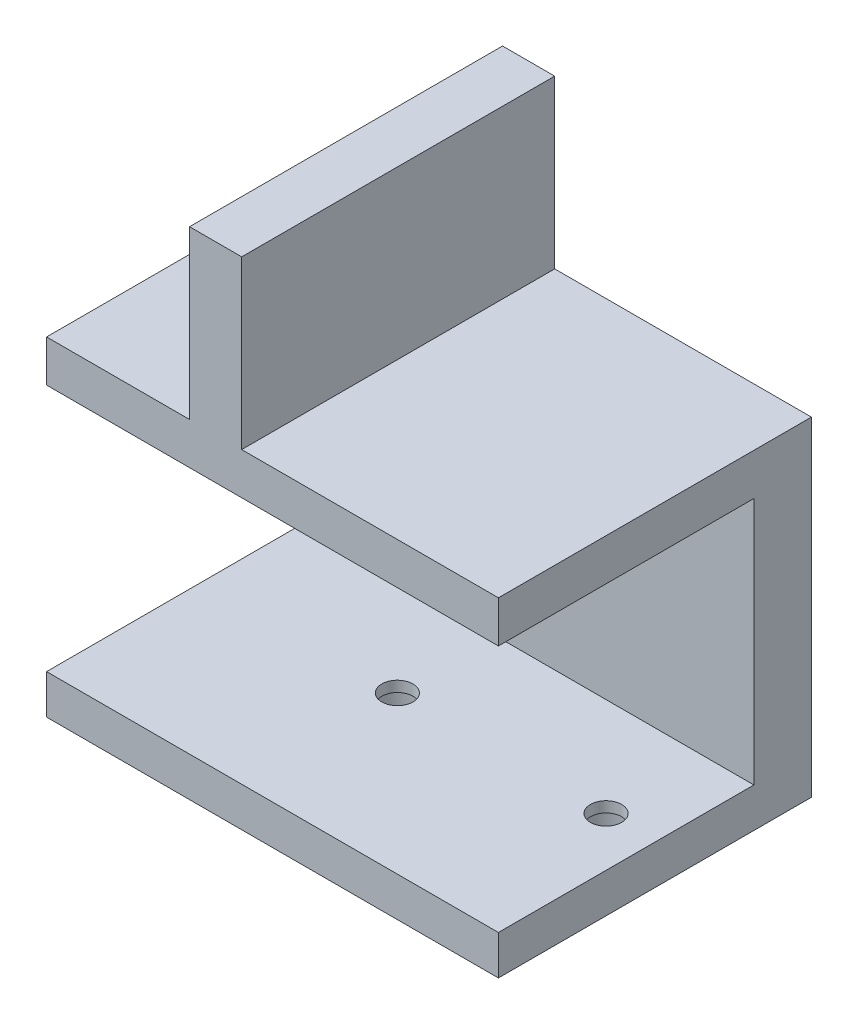
ISO-10303-21;
HEADER;
FILE_DESCRIPTION(('STEP AP214'),'2;1');
FILE_NAME('part.step','',(''),(''),'','','');
FILE_SCHEMA(('AUTOMOTIVE_DESIGN { 1 0 10303 214 1 1 1 1 }'));
ENDSEC;
DATA;
#1=APPLICATION_CONTEXT('core data for automotive mechanical design processes');
#2=APPLICATION_PROTOCOL_DEFINITION('international standard','automotive_design',2000,#1);
#3=PRODUCT_CONTEXT('',#1,'mechanical');
#4=PRODUCT('Part','Part','',(#3));
#5=PRODUCT_RELATED_PRODUCT_CATEGORY('part','',(#4));
#6=PRODUCT_DEFINITION_FORMATION('','',#4);
#7=PRODUCT_DEFINITION_CONTEXT('part definition',#1,'design');
#8=PRODUCT_DEFINITION('design','',#6,#7);
#9=PRODUCT_DEFINITION_SHAPE('','',#8);
#10=(LENGTH_UNIT() NAMED_UNIT(*) SI_UNIT(.MILLI.,.METRE.));
#11=(NAMED_UNIT(*) PLANE_ANGLE_UNIT() SI_UNIT($,.RADIAN.));
#12=(NAMED_UNIT(*) SI_UNIT($,.STERADIAN.) SOLID_ANGLE_UNIT());
#13=UNCERTAINTY_MEASURE_WITH_UNIT(LENGTH_MEASURE(1.E-05),#10,'distance_accuracy_value','');
#14=(GEOMETRIC_REPRESENTATION_CONTEXT(3) GLOBAL_UNCERTAINTY_ASSIGNED_CONTEXT((#13)) GLOBAL_UNIT_ASSIGNED_CONTEXT((#10,
#11,#12)) REPRESENTATION_CONTEXT('',''));
#15=CARTESIAN_POINT('',(0.,0.,0.));
#16=DIRECTION('',(0.,0.,1.));
#17=DIRECTION('',(1.,0.,0.));
#18=AXIS2_PLACEMENT_3D('',#15,#16,#17);
#19=CARTESIAN_POINT('',(-7.87500000000001,-12.7,7.));
#20=DIRECTION('',(1.,0.,0.));
#21=DIRECTION('',(0.,0.,-1.));
#22=AXIS2_PLACEMENT_3D('',#19,#20,#21);
#23=PLANE('',#22);
#24=DIRECTION('',(0.,1.,0.));
#25=VECTOR('',#24,1.);
#26=CARTESIAN_POINT('',(-7.87500000000001,0.,38.1));
#27=LINE('',#26,#25);
#28=CARTESIAN_POINT('',(-7.87500000000001,-47.7,38.1));
#29=VERTEX_POINT('',#28);
#30=CARTESIAN_POINT('',(-7.87500000000001,-42.9,38.1));
#31=VERTEX_POINT('',#30);
#32=EDGE_CURVE('E207',#29,#31,#27,.T.);
#33=ORIENTED_EDGE('',*,*,#32,.T.);
#34=DIRECTION('',(0.,0.,-1.));
#35=VECTOR('',#34,1.);
#36=CARTESIAN_POINT('',(-7.87500000000001,-42.9,-55.9732078766261));
#37=LINE('',#36,#35);
#38=CARTESIAN_POINT('',(-7.87500000000001,-42.9,7.));
#39=VERTEX_POINT('',#38);
#40=EDGE_CURVE('E43',#31,#39,#37,.T.);
#41=ORIENTED_EDGE('',*,*,#40,.T.);
#42=DIRECTION('',(0.,1.,0.));
#43=VECTOR('',#42,1.);
#44=CARTESIAN_POINT('',(-7.87500000000001,-47.7,7.));
#45=LINE('',#44,#43);
#46=CARTESIAN_POINT('',(-7.87500000000001,-12.7,7.));
#47=VERTEX_POINT('',#46);
#48=EDGE_CURVE('E11',#39,#47,#45,.T.);
#49=ORIENTED_EDGE('',*,*,#48,.T.);
#50=DIRECTION('',(0.,0.,1.));
#51=VECTOR('',#50,1.);
#52=CARTESIAN_POINT('',(-7.87500000000001,-12.7,-55.9732078766261));
#53=LINE('',#52,#51);
#54=CARTESIAN_POINT('',(-7.87500000000001,-12.7,38.1));
#55=VERTEX_POINT('',#54);
#56=EDGE_CURVE('E57',#47,#55,#53,.T.);
#57=ORIENTED_EDGE('',*,*,#56,.T.);
#58=CARTESIAN_POINT('',(-7.87500000000001,-7.61999999999999,38.1));
#59=VERTEX_POINT('',#58);
#60=EDGE_CURVE('E204',#55,#59,#27,.T.);
#61=ORIENTED_EDGE('',*,*,#60,.T.);
#62=DIRECTION('',(0.,0.,1.));
#63=VECTOR('',#62,1.);
#64=CARTESIAN_POINT('',(-7.87500000000001,-7.61999999999999,38.1));
#65=LINE('',#64,#63);
#66=CARTESIAN_POINT('',(-7.87500000000001,-7.61999999999999,0.));
#67=VERTEX_POINT('',#66);
#68=EDGE_CURVE('E203',#67,#59,#65,.T.);
#69=ORIENTED_EDGE('',*,*,#68,.F.);
#70=DIRECTION('',(0.,1.,0.));
#71=VECTOR('',#70,1.);
#72=CARTESIAN_POINT('',(-7.87500000000001,0.,0.));
#73=LINE('',#72,#71);
#74=CARTESIAN_POINT('',(-7.87500000000001,-47.7,0.));
#75=VERTEX_POINT('',#74);
#76=EDGE_CURVE('E208',#75,#67,#73,.T.);
#77=ORIENTED_EDGE('',*,*,#76,.F.);
#78=DIRECTION('',(0.,0.,1.));
#79=VECTOR('',#78,1.);
#80=CARTESIAN_POINT('',(-7.87500000000001,-47.7,0.));
#81=LINE('',#80,#79);
#82=EDGE_CURVE('E38',#75,#29,#81,.T.);
#83=ORIENTED_EDGE('',*,*,#82,.T.);
#84=EDGE_LOOP('',(#33,#41,#49,#57,#61,#69,#77,#83));
#85=FACE_BOUND('',#84,.T.);
#86=ADVANCED_FACE('F35',(#85),#23,.F.);
#87=CARTESIAN_POINT('',(43.02365,-44.1948,19.));
#88=DIRECTION('',(0.,1.,0.));
#89=DIRECTION('',(0.,0.,1.));
#90=AXIS2_PLACEMENT_3D('',#87,#88,#89);
#91=PLANE('',#90);
#92=CARTESIAN_POINT('',(41.125,-44.1948,19.));
#93=DIRECTION('',(0.,-1.,0.));
#94=DIRECTION('',(0.,0.,-1.));
#95=AXIS2_PLACEMENT_3D('',#92,#93,#94);
#96=CIRCLE('',#95,1.89865);
#97=CARTESIAN_POINT('',(41.125,-44.1948,17.10135));
#98=VERTEX_POINT('',#97);
#99=EDGE_CURVE('E227',#98,#98,#96,.T.);
#100=ORIENTED_EDGE('',*,*,#99,.F.);
#101=EDGE_LOOP('',(#100));
#102=FACE_BOUND('',#101,.T.);
#103=CARTESIAN_POINT('',(41.125,-44.1948,19.));
#104=DIRECTION('',(0.,-1.,0.));
#105=DIRECTION('',(0.,0.,-1.));
#106=AXIS2_PLACEMENT_3D('',#103,#104,#105);
#107=CIRCLE('',#106,3.57250999999999);
#108=CARTESIAN_POINT('',(41.125,-44.1948,15.42749));
#109=VERTEX_POINT('',#108);
#110=EDGE_CURVE('E230',#109,#109,#107,.T.);
#111=ORIENTED_EDGE('',*,*,#110,.T.);
#112=EDGE_LOOP('',(#111));
#113=FACE_BOUND('',#112,.T.);
#114=ADVANCED_FACE('F264',(#102,#113),#91,.F.);
#115=CARTESIAN_POINT('',(17.62365,-44.1948,19.));
#116=DIRECTION('',(0.,1.,0.));
#117=DIRECTION('',(0.,0.,1.));
#118=AXIS2_PLACEMENT_3D('',#115,#116,#117);
#119=PLANE('',#118);
#120=CARTESIAN_POINT('',(15.725,-44.1948,19.));
#121=DIRECTION('',(0.,-1.,0.));
#122=DIRECTION('',(0.,0.,-1.));
#123=AXIS2_PLACEMENT_3D('',#120,#121,#122);
#124=CIRCLE('',#123,1.89865);
#125=CARTESIAN_POINT('',(15.725,-44.1948,17.10135));
#126=VERTEX_POINT('',#125);
#127=EDGE_CURVE('E239',#126,#126,#124,.T.);
#128=ORIENTED_EDGE('',*,*,#127,.F.);
#129=EDGE_LOOP('',(#128));
#130=FACE_BOUND('',#129,.T.);
#131=CARTESIAN_POINT('',(15.725,-44.1948,19.));
#132=DIRECTION('',(0.,-1.,0.));
#133=DIRECTION('',(0.,0.,-1.));
#134=AXIS2_PLACEMENT_3D('',#131,#132,#133);
#135=CIRCLE('',#134,3.57250999999999);
#136=CARTESIAN_POINT('',(15.725,-44.1948,15.42749));
#137=VERTEX_POINT('',#136);
#138=EDGE_CURVE('E242',#137,#137,#135,.T.);
#139=ORIENTED_EDGE('',*,*,#138,.T.);
#140=EDGE_LOOP('',(#139));
#141=FACE_BOUND('',#140,.T.);
#142=ADVANCED_FACE('F269',(#130,#141),#119,.F.);
#143=CARTESIAN_POINT('',(15.725,-47.7,19.));
#144=DIRECTION('',(0.,-1.,0.));
#145=DIRECTION('',(0.,0.,-1.));
#146=AXIS2_PLACEMENT_3D('',#143,#144,#145);
#147=CYLINDRICAL_SURFACE('',#146,1.89865);
#148=CARTESIAN_POINT('',(15.725,-42.9,19.));
#149=DIRECTION('',(0.,-1.,0.));
#150=DIRECTION('',(0.,0.,-1.));
#151=AXIS2_PLACEMENT_3D('',#148,#149,#150);
#152=CIRCLE('',#151,1.89865);
#153=CARTESIAN_POINT('',(15.725,-42.9,17.10135));
#154=VERTEX_POINT('',#153);
#155=EDGE_CURVE('E236',#154,#154,#152,.F.);
#156=ORIENTED_EDGE('',*,*,#155,.T.);
#157=EDGE_LOOP('',(#156));
#158=FACE_BOUND('',#157,.T.);
#159=ORIENTED_EDGE('',*,*,#127,.T.);
#160=EDGE_LOOP('',(#159));
#161=FACE_BOUND('',#160,.T.);
#162=ADVANCED_FACE('F251',(#158,#161),#147,.F.);
#163=CARTESIAN_POINT('',(41.125,-47.7,19.));
#164=DIRECTION('',(0.,-1.,0.));
#165=DIRECTION('',(0.,0.,-1.));
#166=AXIS2_PLACEMENT_3D('',#163,#164,#165);
#167=CYLINDRICAL_SURFACE('',#166,1.89865);
#168=CARTESIAN_POINT('',(41.125,-42.9,19.));
#169=DIRECTION('',(0.,-1.,0.));
#170=DIRECTION('',(0.,0.,-1.));
#171=AXIS2_PLACEMENT_3D('',#168,#169,#170);
#172=CIRCLE('',#171,1.89865);
#173=CARTESIAN_POINT('',(41.125,-42.9,17.10135));
#174=VERTEX_POINT('',#173);
#175=EDGE_CURVE('E131',#174,#174,#172,.F.);
#176=ORIENTED_EDGE('',*,*,#175,.T.);
#177=EDGE_LOOP('',(#176));
#178=FACE_BOUND('',#177,.T.);
#179=ORIENTED_EDGE('',*,*,#99,.T.);
#180=EDGE_LOOP('',(#179));
#181=FACE_BOUND('',#180,.T.);
#182=ADVANCED_FACE('F303',(#178,#181),#167,.F.);
#183=CARTESIAN_POINT('',(9.525,-7.61999999999999,38.1));
#184=DIRECTION('',(0.,-1.,0.));
#185=DIRECTION('',(1.,0.,0.));
#186=AXIS2_PLACEMENT_3D('',#183,#184,#185);
#187=PLANE('',#186);
#188=DIRECTION('',(-1.,0.,0.));
#189=VECTOR('',#188,1.);
#190=CARTESIAN_POINT('',(9.525,-7.61999999999999,0.));
#191=LINE('',#190,#189);
#192=CARTESIAN_POINT('',(9.525,-7.61999999999999,0.));
#193=VERTEX_POINT('',#192);
#194=EDGE_CURVE('E177',#193,#67,#191,.T.);
#195=ORIENTED_EDGE('',*,*,#194,.T.);
#196=ORIENTED_EDGE('',*,*,#68,.T.);
#197=DIRECTION('',(-1.,0.,0.));
#198=VECTOR('',#197,1.);
#199=CARTESIAN_POINT('',(9.525,-7.61999999999999,38.1));
#200=LINE('',#199,#198);
#201=CARTESIAN_POINT('',(9.525,-7.61999999999999,38.1));
#202=VERTEX_POINT('',#201);
#203=EDGE_CURVE('E183',#202,#59,#200,.T.);
#204=ORIENTED_EDGE('',*,*,#203,.F.);
#205=DIRECTION('',(0.,0.,-1.));
#206=VECTOR('',#205,1.);
#207=CARTESIAN_POINT('',(9.525,-7.61999999999999,38.1));
#208=LINE('',#207,#206);
#209=EDGE_CURVE('E186',#202,#193,#208,.T.);
#210=ORIENTED_EDGE('',*,*,#209,.T.);
#211=EDGE_LOOP('',(#195,#196,#204,#210));
#212=FACE_BOUND('',#211,.T.);
#213=ADVANCED_FACE('F307',(#212),#187,.F.);
#214=CARTESIAN_POINT('',(9.525,-7.61999999999999,38.1));
#215=DIRECTION('',(1.,0.,0.));
#216=DIRECTION('',(0.,1.,0.));
#217=AXIS2_PLACEMENT_3D('',#214,#215,#216);
#218=PLANE('',#217);
#219=DIRECTION('',(0.,-1.,0.));
#220=VECTOR('',#219,1.);
#221=CARTESIAN_POINT('',(9.525,-7.61999999999999,0.));
#222=LINE('',#221,#220);
#223=CARTESIAN_POINT('',(9.525,12.7,0.));
#224=VERTEX_POINT('',#223);
#225=EDGE_CURVE('E191',#224,#193,#222,.T.);
#226=ORIENTED_EDGE('',*,*,#225,.T.);
#227=ORIENTED_EDGE('',*,*,#209,.F.);
#228=DIRECTION('',(0.,-1.,0.));
#229=VECTOR('',#228,1.);
#230=CARTESIAN_POINT('',(9.525,7.62,38.1));
#231=LINE('',#230,#229);
#232=CARTESIAN_POINT('',(9.525,12.7,38.1));
#233=VERTEX_POINT('',#232);
#234=EDGE_CURVE('E181',#233,#202,#231,.T.);
#235=ORIENTED_EDGE('',*,*,#234,.F.);
#236=DIRECTION('',(0.,0.,-1.));
#237=VECTOR('',#236,1.);
#238=CARTESIAN_POINT('',(9.525,12.7,38.1));
#239=LINE('',#238,#237);
#240=EDGE_CURVE('E197',#233,#224,#239,.T.);
#241=ORIENTED_EDGE('',*,*,#240,.T.);
#242=EDGE_LOOP('',(#226,#227,#235,#241));
#243=FACE_BOUND('',#242,.T.);
#244=ADVANCED_FACE('F335',(#243),#218,.F.);
#245=CARTESIAN_POINT('',(15.875,12.7,38.1));
#246=DIRECTION('',(0.,-1.,0.));
#247=DIRECTION('',(0.,0.,-1.));
#248=AXIS2_PLACEMENT_3D('',#245,#246,#247);
#249=PLANE('',#248);
#250=DIRECTION('',(-1.,0.,0.));
#251=VECTOR('',#250,1.);
#252=CARTESIAN_POINT('',(15.875,12.7,0.));
#253=LINE('',#252,#251);
#254=CARTESIAN_POINT('',(15.875,12.7,0.));
#255=VERTEX_POINT('',#254);
#256=EDGE_CURVE('E188',#255,#224,#253,.T.);
#257=ORIENTED_EDGE('',*,*,#256,.T.);
#258=ORIENTED_EDGE('',*,*,#240,.F.);
#259=DIRECTION('',(-1.,0.,0.));
#260=VECTOR('',#259,1.);
#261=CARTESIAN_POINT('',(15.875,12.7,38.1));
#262=LINE('',#261,#260);
#263=CARTESIAN_POINT('',(15.875,12.7,38.1));
#264=VERTEX_POINT('',#263);
#265=EDGE_CURVE('E179',#264,#233,#262,.T.);
#266=ORIENTED_EDGE('',*,*,#265,.F.);
#267=DIRECTION('',(0.,0.,-1.));
#268=VECTOR('',#267,1.);
#269=CARTESIAN_POINT('',(15.875,12.7,38.1));
#270=LINE('',#269,#268);
#271=EDGE_CURVE('E200',#264,#255,#270,.T.);
#272=ORIENTED_EDGE('',*,*,#271,.T.);
#273=EDGE_LOOP('',(#257,#258,#266,#272));
#274=FACE_BOUND('',#273,.T.);
#275=ADVANCED_FACE('F317',(#274),#249,.F.);
#276=CARTESIAN_POINT('',(15.875,-12.7,38.1));
#277=DIRECTION('',(-1.,0.,0.));
#278=DIRECTION('',(0.,-1.,0.));
#279=AXIS2_PLACEMENT_3D('',#276,#277,#278);
#280=PLANE('',#279);
#281=DIRECTION('',(0.,0.,1.));
#282=VECTOR('',#281,1.);
#283=CARTESIAN_POINT('',(15.875,-7.61999999999999,38.1));
#284=LINE('',#283,#282);
#285=CARTESIAN_POINT('',(15.875,-7.61999999999999,0.));
#286=VERTEX_POINT('',#285);
#287=CARTESIAN_POINT('',(15.875,-7.61999999999999,38.1));
#288=VERTEX_POINT('',#287);
#289=EDGE_CURVE('E150',#286,#288,#284,.T.);
#290=ORIENTED_EDGE('',*,*,#289,.F.);
#291=DIRECTION('',(0.,1.,0.));
#292=VECTOR('',#291,1.);
#293=CARTESIAN_POINT('',(15.875,-12.7,0.));
#294=LINE('',#293,#292);
#295=EDGE_CURVE('E169',#286,#255,#294,.T.);
#296=ORIENTED_EDGE('',*,*,#295,.T.);
#297=ORIENTED_EDGE('',*,*,#271,.F.);
#298=DIRECTION('',(0.,1.,0.));
#299=VECTOR('',#298,1.);
#300=CARTESIAN_POINT('',(15.875,-12.7,38.1));
#301=LINE('',#300,#299);
#302=EDGE_CURVE('E176',#288,#264,#301,.T.);
#303=ORIENTED_EDGE('',*,*,#302,.F.);
#304=EDGE_LOOP('',(#290,#296,#297,#303));
#305=FACE_BOUND('',#304,.T.);
#306=ADVANCED_FACE('F312',(#305),#280,.F.);
#307=CARTESIAN_POINT('',(85.5621747140707,-7.61999999999998,38.1));
#308=DIRECTION('',(0.,-1.,0.));
#309=DIRECTION('',(1.,0.,0.));
#310=AXIS2_PLACEMENT_3D('',#307,#308,#309);
#311=PLANE('',#310);
#312=DIRECTION('',(-1.,0.,0.));
#313=VECTOR('',#312,1.);
#314=CARTESIAN_POINT('',(85.5621747140707,-7.61999999999998,38.1));
#315=LINE('',#314,#313);
#316=CARTESIAN_POINT('',(47.125,-7.61999999999999,38.1));
#317=VERTEX_POINT('',#316);
#318=EDGE_CURVE('E137',#317,#288,#315,.T.);
#319=ORIENTED_EDGE('',*,*,#318,.F.);
#320=DIRECTION('',(0.,0.,1.));
#321=VECTOR('',#320,1.);
#322=CARTESIAN_POINT('',(47.125,-7.61999999999999,38.1));
#323=LINE('',#322,#321);
#324=CARTESIAN_POINT('',(47.125,-7.61999999999999,0.));
#325=VERTEX_POINT('',#324);
#326=EDGE_CURVE('E147',#325,#317,#323,.T.);
#327=ORIENTED_EDGE('',*,*,#326,.F.);
#328=DIRECTION('',(-1.,0.,0.));
#329=VECTOR('',#328,1.);
#330=CARTESIAN_POINT('',(85.5621747140707,-7.61999999999998,0.));
#331=LINE('',#330,#329);
#332=EDGE_CURVE('E153',#325,#286,#331,.T.);
#333=ORIENTED_EDGE('',*,*,#332,.T.);
#334=ORIENTED_EDGE('',*,*,#289,.T.);
#335=EDGE_LOOP('',(#319,#327,#333,#334));
#336=FACE_BOUND('',#335,.T.);
#337=ADVANCED_FACE('F293',(#336),#311,.F.);
#338=CARTESIAN_POINT('',(41.125,-47.7,19.));
#339=DIRECTION('',(0.,-1.,0.));
#340=DIRECTION('',(0.,0.,-1.));
#341=AXIS2_PLACEMENT_3D('',#338,#339,#340);
#342=CYLINDRICAL_SURFACE('',#341,3.57250999999999);
#343=ORIENTED_EDGE('',*,*,#110,.F.);
#344=EDGE_LOOP('',(#343));
#345=FACE_BOUND('',#344,.T.);
#346=CARTESIAN_POINT('',(41.125,-47.7,19.));
#347=DIRECTION('',(0.,-1.,0.));
#348=DIRECTION('',(0.,0.,-1.));
#349=AXIS2_PLACEMENT_3D('',#346,#347,#348);
#350=CIRCLE('',#349,3.57250999999999);
#351=CARTESIAN_POINT('',(41.125,-47.7,15.42749));
#352=VERTEX_POINT('',#351);
#353=EDGE_CURVE('E233',#352,#352,#350,.T.);
#354=ORIENTED_EDGE('',*,*,#353,.T.);
#355=EDGE_LOOP('',(#354));
#356=FACE_BOUND('',#355,.T.);
#357=ADVANCED_FACE('F287',(#345,#356),#342,.F.);
#358=CARTESIAN_POINT('',(15.725,-47.7,19.));
#359=DIRECTION('',(0.,-1.,0.));
#360=DIRECTION('',(0.,0.,-1.));
#361=AXIS2_PLACEMENT_3D('',#358,#359,#360);
#362=CYLINDRICAL_SURFACE('',#361,3.57250999999999);
#363=ORIENTED_EDGE('',*,*,#138,.F.);
#364=EDGE_LOOP('',(#363));
#365=FACE_BOUND('',#364,.T.);
#366=CARTESIAN_POINT('',(15.725,-47.7,19.));
#367=DIRECTION('',(0.,-1.,0.));
#368=DIRECTION('',(0.,0.,-1.));
#369=AXIS2_PLACEMENT_3D('',#366,#367,#368);
#370=CIRCLE('',#369,3.57250999999999);
#371=CARTESIAN_POINT('',(15.725,-47.7,15.42749));
#372=VERTEX_POINT('',#371);
#373=EDGE_CURVE('E245',#372,#372,#370,.T.);
#374=ORIENTED_EDGE('',*,*,#373,.T.);
#375=EDGE_LOOP('',(#374));
#376=FACE_BOUND('',#375,.T.);
#377=ADVANCED_FACE('F283',(#365,#376),#362,.F.);
#378=CARTESIAN_POINT('',(0.,0.,38.1));
#379=DIRECTION('',(0.,0.,1.));
#380=DIRECTION('',(1.,0.,0.));
#381=AXIS2_PLACEMENT_3D('',#378,#379,#380);
#382=PLANE('',#381);
#383=ORIENTED_EDGE('',*,*,#32,.F.);
#384=DIRECTION('',(-1.,0.,0.));
#385=VECTOR('',#384,1.);
#386=CARTESIAN_POINT('',(-44.875,-47.7,38.1));
#387=LINE('',#386,#385);
#388=CARTESIAN_POINT('',(47.125,-47.7,38.1));
#389=VERTEX_POINT('',#388);
#390=EDGE_CURVE('E158',#389,#29,#387,.T.);
#391=ORIENTED_EDGE('',*,*,#390,.F.);
#392=DIRECTION('',(0.,-1.,0.));
#393=VECTOR('',#392,1.);
#394=CARTESIAN_POINT('',(47.125,-42.9,38.1));
#395=LINE('',#394,#393);
#396=CARTESIAN_POINT('',(47.125,-42.9,38.1));
#397=VERTEX_POINT('',#396);
#398=EDGE_CURVE('E167',#397,#389,#395,.T.);
#399=ORIENTED_EDGE('',*,*,#398,.F.);
#400=DIRECTION('',(-1.,0.,0.));
#401=VECTOR('',#400,1.);
#402=CARTESIAN_POINT('',(-44.875,-42.9,38.1));
#403=LINE('',#402,#401);
#404=EDGE_CURVE('E163',#397,#31,#403,.T.);
#405=ORIENTED_EDGE('',*,*,#404,.T.);
#406=EDGE_LOOP('',(#383,#391,#399,#405));
#407=FACE_BOUND('',#406,.T.);
#408=ADVANCED_FACE('F221',(#407),#382,.T.);
#409=CARTESIAN_POINT('',(47.125,-42.9,38.1));
#410=DIRECTION('',(1.,0.,0.));
#411=DIRECTION('',(0.,0.,-1.));
#412=AXIS2_PLACEMENT_3D('',#409,#410,#411);
#413=PLANE('',#412);
#414=ORIENTED_EDGE('',*,*,#398,.T.);
#415=DIRECTION('',(0.,0.,1.));
#416=VECTOR('',#415,1.);
#417=CARTESIAN_POINT('',(47.125,-47.7,38.1));
#418=LINE('',#417,#416);
#419=CARTESIAN_POINT('',(47.125,-47.7,0.));
#420=VERTEX_POINT('',#419);
#421=EDGE_CURVE('E145',#420,#389,#418,.T.);
#422=ORIENTED_EDGE('',*,*,#421,.F.);
#423=DIRECTION('',(0.,-1.,0.));
#424=VECTOR('',#423,1.);
#425=CARTESIAN_POINT('',(47.125,-42.9,0.));
#426=LINE('',#425,#424);
#427=EDGE_CURVE('E166',#325,#420,#426,.T.);
#428=ORIENTED_EDGE('',*,*,#427,.F.);
#429=ORIENTED_EDGE('',*,*,#326,.T.);
#430=DIRECTION('',(0.,-1.,0.));
#431=VECTOR('',#430,1.);
#432=CARTESIAN_POINT('',(47.125,-12.7,38.1));
#433=LINE('',#432,#431);
#434=CARTESIAN_POINT('',(47.125,-12.7,38.1));
#435=VERTEX_POINT('',#434);
#436=EDGE_CURVE('E142',#317,#435,#433,.T.);
#437=ORIENTED_EDGE('',*,*,#436,.T.);
#438=DIRECTION('',(0.,0.,-1.));
#439=VECTOR('',#438,1.);
#440=CARTESIAN_POINT('',(47.125,-12.7,38.1));
#441=LINE('',#440,#439);
#442=CARTESIAN_POINT('',(47.125,-12.7,7.));
#443=VERTEX_POINT('',#442);
#444=EDGE_CURVE('E135',#435,#443,#441,.T.);
#445=ORIENTED_EDGE('',*,*,#444,.T.);
#446=DIRECTION('',(0.,-1.,0.));
#447=VECTOR('',#446,1.);
#448=CARTESIAN_POINT('',(47.125,-47.7,7.));
#449=LINE('',#448,#447);
#450=CARTESIAN_POINT('',(47.125,-42.9,7.00000000000001));
#451=VERTEX_POINT('',#450);
#452=EDGE_CURVE('E123',#443,#451,#449,.T.);
#453=ORIENTED_EDGE('',*,*,#452,.T.);
#454=DIRECTION('',(0.,0.,1.));
#455=VECTOR('',#454,1.);
#456=CARTESIAN_POINT('',(47.125,-42.9,38.1));
#457=LINE('',#456,#455);
#458=EDGE_CURVE('E161',#451,#397,#457,.T.);
#459=ORIENTED_EDGE('',*,*,#458,.T.);
#460=EDGE_LOOP('',(#414,#422,#428,#429,#437,#445,#453,#459));
#461=FACE_BOUND('',#460,.T.);
#462=ADVANCED_FACE('F140',(#461),#413,.T.);
#463=CARTESIAN_POINT('',(0.,-42.9,0.));
#464=DIRECTION('',(0.,-1.,0.));
#465=DIRECTION('',(0.,0.,-1.));
#466=AXIS2_PLACEMENT_3D('',#463,#464,#465);
#467=PLANE('',#466);
#468=ORIENTED_EDGE('',*,*,#175,.F.);
#469=EDGE_LOOP('',(#468));
#470=FACE_BOUND('',#469,.T.);
#471=ORIENTED_EDGE('',*,*,#458,.F.);
#472=DIRECTION('',(-1.,0.,0.));
#473=VECTOR('',#472,1.);
#474=CARTESIAN_POINT('',(0.,-42.9,7.));
#475=LINE('',#474,#473);
#476=EDGE_CURVE('E127',#451,#39,#475,.T.);
#477=ORIENTED_EDGE('',*,*,#476,.T.);
#478=ORIENTED_EDGE('',*,*,#40,.F.);
#479=ORIENTED_EDGE('',*,*,#404,.F.);
#480=EDGE_LOOP('',(#471,#477,#478,#479));
#481=FACE_BOUND('',#480,.T.);
#482=ORIENTED_EDGE('',*,*,#155,.F.);
#483=EDGE_LOOP('',(#482));
#484=FACE_BOUND('',#483,.T.);
#485=ADVANCED_FACE('F223',(#470,#481,#484),#467,.F.);
#486=CARTESIAN_POINT('',(15.875,-12.7,38.1));
#487=DIRECTION('',(0.,1.,0.));
#488=DIRECTION('',(0.,0.,1.));
#489=AXIS2_PLACEMENT_3D('',#486,#487,#488);
#490=PLANE('',#489);
#491=ORIENTED_EDGE('',*,*,#56,.F.);
#492=DIRECTION('',(1.,0.,0.));
#493=VECTOR('',#492,1.);
#494=CARTESIAN_POINT('',(15.875,-12.7,7.));
#495=LINE('',#494,#493);
#496=EDGE_CURVE('E125',#47,#443,#495,.T.);
#497=ORIENTED_EDGE('',*,*,#496,.T.);
#498=ORIENTED_EDGE('',*,*,#444,.F.);
#499=DIRECTION('',(1.,0.,0.));
#500=VECTOR('',#499,1.);
#501=CARTESIAN_POINT('',(15.875,-12.7,38.1));
#502=LINE('',#501,#500);
#503=EDGE_CURVE('E174',#55,#435,#502,.T.);
#504=ORIENTED_EDGE('',*,*,#503,.F.);
#505=EDGE_LOOP('',(#491,#497,#498,#504));
#506=FACE_BOUND('',#505,.T.);
#507=ADVANCED_FACE('F134',(#506),#490,.F.);
#508=CARTESIAN_POINT('',(-48.5616857829438,-47.7,7.));
#509=DIRECTION('',(0.,0.,1.));
#510=DIRECTION('',(1.,0.,0.));
#511=AXIS2_PLACEMENT_3D('',#508,#509,#510);
#512=PLANE('',#511);
#513=ORIENTED_EDGE('',*,*,#496,.F.);
#514=ORIENTED_EDGE('',*,*,#48,.F.);
#515=ORIENTED_EDGE('',*,*,#476,.F.);
#516=ORIENTED_EDGE('',*,*,#452,.F.);
#517=EDGE_LOOP('',(#513,#514,#515,#516));
#518=FACE_BOUND('',#517,.T.);
#519=ADVANCED_FACE('F124',(#518),#512,.T.);
#520=CARTESIAN_POINT('',(0.,0.,0.));
#521=DIRECTION('',(0.,0.,1.));
#522=DIRECTION('',(1.,0.,0.));
#523=AXIS2_PLACEMENT_3D('',#520,#521,#522);
#524=PLANE('',#523);
#525=DIRECTION('',(1.,0.,0.));
#526=VECTOR('',#525,1.);
#527=CARTESIAN_POINT('',(-44.875,-47.7,0.));
#528=LINE('',#527,#526);
#529=EDGE_CURVE('E143',#75,#420,#528,.T.);
#530=ORIENTED_EDGE('',*,*,#529,.F.);
#531=ORIENTED_EDGE('',*,*,#76,.T.);
#532=ORIENTED_EDGE('',*,*,#194,.F.);
#533=ORIENTED_EDGE('',*,*,#225,.F.);
#534=ORIENTED_EDGE('',*,*,#256,.F.);
#535=ORIENTED_EDGE('',*,*,#295,.F.);
#536=ORIENTED_EDGE('',*,*,#332,.F.);
#537=ORIENTED_EDGE('',*,*,#427,.T.);
#538=EDGE_LOOP('',(#530,#531,#532,#533,#534,#535,#536,#537));
#539=FACE_BOUND('',#538,.T.);
#540=ADVANCED_FACE('F279',(#539),#524,.F.);
#541=CARTESIAN_POINT('',(0.,-47.7,0.));
#542=DIRECTION('',(0.,-1.,0.));
#543=DIRECTION('',(0.,0.,-1.));
#544=AXIS2_PLACEMENT_3D('',#541,#542,#543);
#545=PLANE('',#544);
#546=ORIENTED_EDGE('',*,*,#82,.F.);
#547=ORIENTED_EDGE('',*,*,#529,.T.);
#548=ORIENTED_EDGE('',*,*,#421,.T.);
#549=ORIENTED_EDGE('',*,*,#390,.T.);
#550=EDGE_LOOP('',(#546,#547,#548,#549));
#551=FACE_BOUND('',#550,.T.);
#552=ORIENTED_EDGE('',*,*,#373,.F.);
#553=EDGE_LOOP('',(#552));
#554=FACE_BOUND('',#553,.T.);
#555=ORIENTED_EDGE('',*,*,#353,.F.);
#556=EDGE_LOOP('',(#555));
#557=FACE_BOUND('',#556,.T.);
#558=ADVANCED_FACE('F273',(#551,#554,#557),#545,.T.);
#559=ORIENTED_EDGE('',*,*,#60,.F.);
#560=ORIENTED_EDGE('',*,*,#503,.T.);
#561=ORIENTED_EDGE('',*,*,#436,.F.);
#562=ORIENTED_EDGE('',*,*,#318,.T.);
#563=ORIENTED_EDGE('',*,*,#302,.T.);
#564=ORIENTED_EDGE('',*,*,#265,.T.);
#565=ORIENTED_EDGE('',*,*,#234,.T.);
#566=ORIENTED_EDGE('',*,*,#203,.T.);
#567=EDGE_LOOP('',(#559,#560,#561,#562,#563,#564,#565,#566));
#568=FACE_BOUND('',#567,.T.);
#569=ADVANCED_FACE('F265',(#568),#382,.T.);
#570=CLOSED_SHELL('',(#86,#114,#142,#162,#182,#213,#244,#275,#306,#337,#357,#377,#408,#462,#485,
#507,#519,#540,#558,#569));
#571=MANIFOLD_SOLID_BREP('B2',#570);
#572=ADVANCED_BREP_SHAPE_REPRESENTATION('',(#18,#571),#14);
#573=SHAPE_DEFINITION_REPRESENTATION(#9,#572);
ENDSEC;
END-ISO-10303-21;
